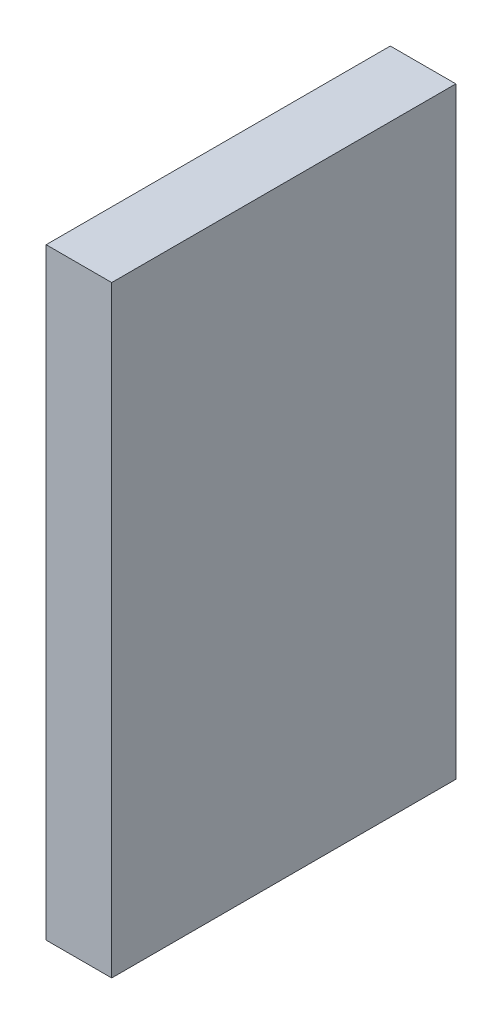
ISO-10303-21;
HEADER;
FILE_DESCRIPTION(('STEP AP214'),'2;1');
FILE_NAME('part.step','',(''),(''),'','','');
FILE_SCHEMA(('AUTOMOTIVE_DESIGN { 1 0 10303 214 1 1 1 1 }'));
ENDSEC;
DATA;
#1=APPLICATION_CONTEXT('core data for automotive mechanical design processes');
#2=APPLICATION_PROTOCOL_DEFINITION('international standard','automotive_design',2000,#1);
#3=PRODUCT_CONTEXT('',#1,'mechanical');
#4=PRODUCT('Part','Part','',(#3));
#5=PRODUCT_RELATED_PRODUCT_CATEGORY('part','',(#4));
#6=PRODUCT_DEFINITION_FORMATION('','',#4);
#7=PRODUCT_DEFINITION_CONTEXT('part definition',#1,'design');
#8=PRODUCT_DEFINITION('design','',#6,#7);
#9=PRODUCT_DEFINITION_SHAPE('','',#8);
#10=(LENGTH_UNIT() NAMED_UNIT(*) SI_UNIT(.MILLI.,.METRE.));
#11=(NAMED_UNIT(*) PLANE_ANGLE_UNIT() SI_UNIT($,.RADIAN.));
#12=(NAMED_UNIT(*) SI_UNIT($,.STERADIAN.) SOLID_ANGLE_UNIT());
#13=UNCERTAINTY_MEASURE_WITH_UNIT(LENGTH_MEASURE(1.E-05),#10,'distance_accuracy_value','');
#14=(GEOMETRIC_REPRESENTATION_CONTEXT(3) GLOBAL_UNCERTAINTY_ASSIGNED_CONTEXT((#13)) GLOBAL_UNIT_ASSIGNED_CONTEXT((#10,
#11,#12)) REPRESENTATION_CONTEXT('',''));
#15=CARTESIAN_POINT('',(0.,0.,0.));
#16=DIRECTION('',(0.,0.,1.));
#17=DIRECTION('',(1.,0.,0.));
#18=AXIS2_PLACEMENT_3D('',#15,#16,#17);
#19=CARTESIAN_POINT('',(0.,0.,0.));
#20=DIRECTION('',(0.,0.,-1.));
#21=DIRECTION('',(-1.,0.,0.));
#22=AXIS2_PLACEMENT_3D('',#19,#20,#21);
#23=PLANE('',#22);
#24=DIRECTION('',(0.,-1.,0.));
#25=VECTOR('',#24,1.);
#26=CARTESIAN_POINT('',(215.,-300.,0.));
#27=LINE('',#26,#25);
#28=CARTESIAN_POINT('',(215.,-125.,0.));
#29=VERTEX_POINT('',#28);
#30=CARTESIAN_POINT('',(215.,-300.,0.));
#31=VERTEX_POINT('',#30);
#32=EDGE_CURVE('E83',#29,#31,#27,.T.);
#33=ORIENTED_EDGE('',*,*,#32,.F.);
#34=DIRECTION('',(-1.,0.,0.));
#35=VECTOR('',#34,1.);
#36=CARTESIAN_POINT('',(215.,-125.,0.));
#37=LINE('',#36,#35);
#38=CARTESIAN_POINT('',(234.05,-125.,0.));
#39=VERTEX_POINT('',#38);
#40=EDGE_CURVE('E94',#39,#29,#37,.T.);
#41=ORIENTED_EDGE('',*,*,#40,.F.);
#42=DIRECTION('',(0.,1.,0.));
#43=VECTOR('',#42,1.);
#44=CARTESIAN_POINT('',(234.05,-300.,0.));
#45=LINE('',#44,#43);
#46=CARTESIAN_POINT('',(234.05,-300.,0.));
#47=VERTEX_POINT('',#46);
#48=EDGE_CURVE('E85',#47,#39,#45,.T.);
#49=ORIENTED_EDGE('',*,*,#48,.F.);
#50=DIRECTION('',(1.,0.,0.));
#51=VECTOR('',#50,1.);
#52=CARTESIAN_POINT('',(215.,-300.,0.));
#53=LINE('',#52,#51);
#54=EDGE_CURVE('E75',#31,#47,#53,.T.);
#55=ORIENTED_EDGE('',*,*,#54,.F.);
#56=EDGE_LOOP('',(#33,#41,#49,#55));
#57=FACE_BOUND('',#56,.T.);
#58=ADVANCED_FACE('F33',(#57),#23,.T.);
#59=CARTESIAN_POINT('',(215.,-125.,276.033810672836));
#60=DIRECTION('',(0.,-1.,0.));
#61=DIRECTION('',(0.,0.,-1.));
#62=AXIS2_PLACEMENT_3D('',#59,#60,#61);
#63=PLANE('',#62);
#64=DIRECTION('',(0.,0.,-1.));
#65=VECTOR('',#64,1.);
#66=CARTESIAN_POINT('',(215.,-125.,276.033810672836));
#67=LINE('',#66,#65);
#68=CARTESIAN_POINT('',(215.,-125.,100.));
#69=VERTEX_POINT('',#68);
#70=EDGE_CURVE('E88',#69,#29,#67,.T.);
#71=ORIENTED_EDGE('',*,*,#70,.F.);
#72=DIRECTION('',(1.,0.,0.));
#73=VECTOR('',#72,1.);
#74=CARTESIAN_POINT('',(215.,-125.,100.));
#75=LINE('',#74,#73);
#76=CARTESIAN_POINT('',(234.05,-125.,100.));
#77=VERTEX_POINT('',#76);
#78=EDGE_CURVE('E37',#69,#77,#75,.T.);
#79=ORIENTED_EDGE('',*,*,#78,.T.);
#80=DIRECTION('',(0.,0.,-1.));
#81=VECTOR('',#80,1.);
#82=CARTESIAN_POINT('',(234.05,-125.,276.033810672836));
#83=LINE('',#82,#81);
#84=EDGE_CURVE('E97',#77,#39,#83,.T.);
#85=ORIENTED_EDGE('',*,*,#84,.T.);
#86=ORIENTED_EDGE('',*,*,#40,.T.);
#87=EDGE_LOOP('',(#71,#79,#85,#86));
#88=FACE_BOUND('',#87,.T.);
#89=ADVANCED_FACE('F106',(#88),#63,.F.);
#90=CARTESIAN_POINT('',(234.05,-300.,276.033810672836));
#91=DIRECTION('',(-1.,0.,0.));
#92=DIRECTION('',(0.,0.,1.));
#93=AXIS2_PLACEMENT_3D('',#90,#91,#92);
#94=PLANE('',#93);
#95=ORIENTED_EDGE('',*,*,#84,.F.);
#96=DIRECTION('',(0.,-1.,0.));
#97=VECTOR('',#96,1.);
#98=CARTESIAN_POINT('',(234.05,-300.,100.));
#99=LINE('',#98,#97);
#100=CARTESIAN_POINT('',(234.05,-300.,100.));
#101=VERTEX_POINT('',#100);
#102=EDGE_CURVE('E103',#77,#101,#99,.T.);
#103=ORIENTED_EDGE('',*,*,#102,.T.);
#104=DIRECTION('',(0.,0.,-1.));
#105=VECTOR('',#104,1.);
#106=CARTESIAN_POINT('',(234.05,-300.,276.033810672836));
#107=LINE('',#106,#105);
#108=EDGE_CURVE('E79',#101,#47,#107,.T.);
#109=ORIENTED_EDGE('',*,*,#108,.T.);
#110=ORIENTED_EDGE('',*,*,#48,.T.);
#111=EDGE_LOOP('',(#95,#103,#109,#110));
#112=FACE_BOUND('',#111,.T.);
#113=ADVANCED_FACE('F102',(#112),#94,.F.);
#114=CARTESIAN_POINT('',(215.,-300.,276.033810672836));
#115=DIRECTION('',(0.,1.,0.));
#116=DIRECTION('',(0.,0.,1.));
#117=AXIS2_PLACEMENT_3D('',#114,#115,#116);
#118=PLANE('',#117);
#119=ORIENTED_EDGE('',*,*,#108,.F.);
#120=DIRECTION('',(-1.,0.,0.));
#121=VECTOR('',#120,1.);
#122=CARTESIAN_POINT('',(215.,-300.,100.));
#123=LINE('',#122,#121);
#124=CARTESIAN_POINT('',(215.,-300.,100.));
#125=VERTEX_POINT('',#124);
#126=EDGE_CURVE('E42',#101,#125,#123,.T.);
#127=ORIENTED_EDGE('',*,*,#126,.T.);
#128=DIRECTION('',(0.,0.,-1.));
#129=VECTOR('',#128,1.);
#130=CARTESIAN_POINT('',(215.,-300.,276.033810672836));
#131=LINE('',#130,#129);
#132=EDGE_CURVE('E72',#125,#31,#131,.T.);
#133=ORIENTED_EDGE('',*,*,#132,.T.);
#134=ORIENTED_EDGE('',*,*,#54,.T.);
#135=EDGE_LOOP('',(#119,#127,#133,#134));
#136=FACE_BOUND('',#135,.T.);
#137=ADVANCED_FACE('F74',(#136),#118,.F.);
#138=CARTESIAN_POINT('',(215.,-300.,276.033810672836));
#139=DIRECTION('',(1.,0.,0.));
#140=DIRECTION('',(0.,0.,-1.));
#141=AXIS2_PLACEMENT_3D('',#138,#139,#140);
#142=PLANE('',#141);
#143=ORIENTED_EDGE('',*,*,#132,.F.);
#144=DIRECTION('',(0.,1.,0.));
#145=VECTOR('',#144,1.);
#146=CARTESIAN_POINT('',(215.,-300.,100.));
#147=LINE('',#146,#145);
#148=EDGE_CURVE('E11',#125,#69,#147,.T.);
#149=ORIENTED_EDGE('',*,*,#148,.T.);
#150=ORIENTED_EDGE('',*,*,#70,.T.);
#151=ORIENTED_EDGE('',*,*,#32,.T.);
#152=EDGE_LOOP('',(#143,#149,#150,#151));
#153=FACE_BOUND('',#152,.T.);
#154=ADVANCED_FACE('F35',(#153),#142,.F.);
#155=CARTESIAN_POINT('',(0.,0.,100.));
#156=DIRECTION('',(0.,0.,-1.));
#157=DIRECTION('',(0.,-1.,0.));
#158=AXIS2_PLACEMENT_3D('',#155,#156,#157);
#159=PLANE('',#158);
#160=ORIENTED_EDGE('',*,*,#126,.F.);
#161=ORIENTED_EDGE('',*,*,#102,.F.);
#162=ORIENTED_EDGE('',*,*,#78,.F.);
#163=ORIENTED_EDGE('',*,*,#148,.F.);
#164=EDGE_LOOP('',(#160,#161,#162,#163));
#165=FACE_BOUND('',#164,.T.);
#166=ADVANCED_FACE('F120',(#165),#159,.F.);
#167=CLOSED_SHELL('',(#58,#89,#113,#137,#154,#166));
#168=MANIFOLD_SOLID_BREP('B2',#167);
#169=ADVANCED_BREP_SHAPE_REPRESENTATION('',(#18,#168),#14);
#170=SHAPE_DEFINITION_REPRESENTATION(#9,#169);
ENDSEC;
END-ISO-10303-21;
